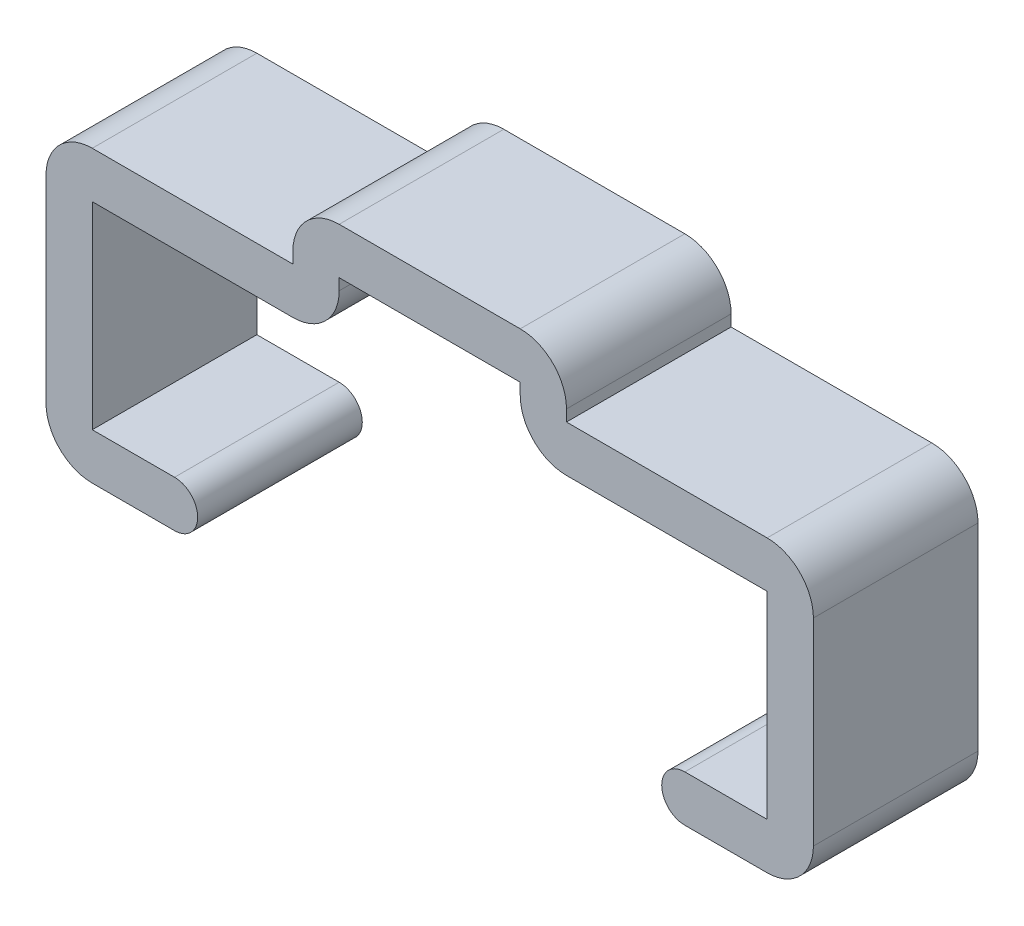
ISO-10303-21;
HEADER;
FILE_DESCRIPTION(('STEP AP214'),'2;1');
FILE_NAME('part.step','',(''),(''),'','','');
FILE_SCHEMA(('AUTOMOTIVE_DESIGN { 1 0 10303 214 1 1 1 1 }'));
ENDSEC;
DATA;
#1=APPLICATION_CONTEXT('core data for automotive mechanical design processes');
#2=APPLICATION_PROTOCOL_DEFINITION('international standard','automotive_design',2000,#1);
#3=PRODUCT_CONTEXT('',#1,'mechanical');
#4=PRODUCT('Part','Part','',(#3));
#5=PRODUCT_RELATED_PRODUCT_CATEGORY('part','',(#4));
#6=PRODUCT_DEFINITION_FORMATION('','',#4);
#7=PRODUCT_DEFINITION_CONTEXT('part definition',#1,'design');
#8=PRODUCT_DEFINITION('design','',#6,#7);
#9=PRODUCT_DEFINITION_SHAPE('','',#8);
#10=(LENGTH_UNIT() NAMED_UNIT(*) SI_UNIT(.MILLI.,.METRE.));
#11=(NAMED_UNIT(*) PLANE_ANGLE_UNIT() SI_UNIT($,.RADIAN.));
#12=(NAMED_UNIT(*) SI_UNIT($,.STERADIAN.) SOLID_ANGLE_UNIT());
#13=UNCERTAINTY_MEASURE_WITH_UNIT(LENGTH_MEASURE(1.E-05),#10,'distance_accuracy_value','');
#14=(GEOMETRIC_REPRESENTATION_CONTEXT(3) GLOBAL_UNCERTAINTY_ASSIGNED_CONTEXT((#13)) GLOBAL_UNIT_ASSIGNED_CONTEXT((#10,
#11,#12)) REPRESENTATION_CONTEXT('',''));
#15=CARTESIAN_POINT('',(0.,0.,0.));
#16=DIRECTION('',(0.,0.,1.));
#17=DIRECTION('',(1.,0.,0.));
#18=AXIS2_PLACEMENT_3D('',#15,#16,#17);
#19=CARTESIAN_POINT('',(-20.5,6.,10.));
#20=DIRECTION('',(-1.,0.,0.));
#21=DIRECTION('',(0.,-1.,0.));
#22=AXIS2_PLACEMENT_3D('',#19,#20,#21);
#23=PLANE('',#22);
#24=DIRECTION('',(0.,1.,0.));
#25=VECTOR('',#24,1.);
#26=CARTESIAN_POINT('',(-20.5,6.,0.));
#27=LINE('',#26,#25);
#28=CARTESIAN_POINT('',(-20.5,-6.,0.));
#29=VERTEX_POINT('',#28);
#30=CARTESIAN_POINT('',(-20.5,6.,0.));
#31=VERTEX_POINT('',#30);
#32=EDGE_CURVE('E260',#29,#31,#27,.T.);
#33=ORIENTED_EDGE('',*,*,#32,.T.);
#34=DIRECTION('',(0.,0.,-1.));
#35=VECTOR('',#34,1.);
#36=CARTESIAN_POINT('',(-20.5,6.,10.));
#37=LINE('',#36,#35);
#38=CARTESIAN_POINT('',(-20.5,6.,10.));
#39=VERTEX_POINT('',#38);
#40=EDGE_CURVE('E11',#39,#31,#37,.T.);
#41=ORIENTED_EDGE('',*,*,#40,.F.);
#42=DIRECTION('',(0.,1.,0.));
#43=VECTOR('',#42,1.);
#44=CARTESIAN_POINT('',(-20.5,6.,10.));
#45=LINE('',#44,#43);
#46=CARTESIAN_POINT('',(-20.5,-6.,10.));
#47=VERTEX_POINT('',#46);
#48=EDGE_CURVE('E342',#47,#39,#45,.T.);
#49=ORIENTED_EDGE('',*,*,#48,.F.);
#50=DIRECTION('',(0.,0.,-1.));
#51=VECTOR('',#50,1.);
#52=CARTESIAN_POINT('',(-20.5,-6.,10.));
#53=LINE('',#52,#51);
#54=EDGE_CURVE('E256',#47,#29,#53,.T.);
#55=ORIENTED_EDGE('',*,*,#54,.T.);
#56=EDGE_LOOP('',(#33,#41,#49,#55));
#57=FACE_BOUND('',#56,.T.);
#58=ADVANCED_FACE('F39',(#57),#23,.F.);
#59=CARTESIAN_POINT('',(-20.5,6.,10.));
#60=DIRECTION('',(0.,1.,0.));
#61=DIRECTION('',(0.,0.,1.));
#62=AXIS2_PLACEMENT_3D('',#59,#60,#61);
#63=PLANE('',#62);
#64=DIRECTION('',(1.,0.,0.));
#65=VECTOR('',#64,1.);
#66=CARTESIAN_POINT('',(-20.5,6.,0.));
#67=LINE('',#66,#65);
#68=CARTESIAN_POINT('',(-8.31,6.,0.));
#69=VERTEX_POINT('',#68);
#70=EDGE_CURVE('E264',#31,#69,#67,.T.);
#71=ORIENTED_EDGE('',*,*,#70,.T.);
#72=DIRECTION('',(0.,0.,-1.));
#73=VECTOR('',#72,1.);
#74=CARTESIAN_POINT('',(-8.31,6.,10.));
#75=LINE('',#74,#73);
#76=CARTESIAN_POINT('',(-8.31,6.,10.));
#77=VERTEX_POINT('',#76);
#78=EDGE_CURVE('E48',#77,#69,#75,.T.);
#79=ORIENTED_EDGE('',*,*,#78,.F.);
#80=DIRECTION('',(1.,0.,0.));
#81=VECTOR('',#80,1.);
#82=CARTESIAN_POINT('',(-20.5,6.,10.));
#83=LINE('',#82,#81);
#84=EDGE_CURVE('E159',#39,#77,#83,.T.);
#85=ORIENTED_EDGE('',*,*,#84,.F.);
#86=ORIENTED_EDGE('',*,*,#40,.T.);
#87=EDGE_LOOP('',(#71,#79,#85,#86));
#88=FACE_BOUND('',#87,.T.);
#89=ADVANCED_FACE('F548',(#88),#63,.F.);
#90=CARTESIAN_POINT('',(-8.31,8.81,10.));
#91=DIRECTION('',(0.,0.,-1.));
#92=DIRECTION('',(-1.,0.,0.));
#93=AXIS2_PLACEMENT_3D('',#90,#91,#92);
#94=CYLINDRICAL_SURFACE('',#93,2.81);
#95=CARTESIAN_POINT('',(-8.31,8.81,0.));
#96=DIRECTION('',(0.,0.,1.));
#97=DIRECTION('',(1.,0.,0.));
#98=AXIS2_PLACEMENT_3D('',#95,#96,#97);
#99=CIRCLE('',#98,2.81);
#100=CARTESIAN_POINT('',(-5.5,8.81,0.));
#101=VERTEX_POINT('',#100);
#102=EDGE_CURVE('E267',#69,#101,#99,.T.);
#103=ORIENTED_EDGE('',*,*,#102,.T.);
#104=DIRECTION('',(0.,0.,-1.));
#105=VECTOR('',#104,1.);
#106=CARTESIAN_POINT('',(-5.5,8.81,10.));
#107=LINE('',#106,#105);
#108=CARTESIAN_POINT('',(-5.5,8.81,10.));
#109=VERTEX_POINT('',#108);
#110=EDGE_CURVE('E433',#109,#101,#107,.T.);
#111=ORIENTED_EDGE('',*,*,#110,.F.);
#112=CARTESIAN_POINT('',(-8.31,8.81,10.));
#113=DIRECTION('',(0.,0.,1.));
#114=DIRECTION('',(1.,0.,0.));
#115=AXIS2_PLACEMENT_3D('',#112,#113,#114);
#116=CIRCLE('',#115,2.81);
#117=EDGE_CURVE('E443',#77,#109,#116,.T.);
#118=ORIENTED_EDGE('',*,*,#117,.F.);
#119=ORIENTED_EDGE('',*,*,#78,.T.);
#120=EDGE_LOOP('',(#103,#111,#118,#119));
#121=FACE_BOUND('',#120,.T.);
#122=ADVANCED_FACE('F441',(#121),#94,.T.);
#123=CARTESIAN_POINT('',(-5.5,9.5,10.));
#124=DIRECTION('',(-1.,0.,0.));
#125=DIRECTION('',(0.,-1.,0.));
#126=AXIS2_PLACEMENT_3D('',#123,#124,#125);
#127=PLANE('',#126);
#128=DIRECTION('',(0.,1.,0.));
#129=VECTOR('',#128,1.);
#130=CARTESIAN_POINT('',(-5.5,9.5,0.));
#131=LINE('',#130,#129);
#132=CARTESIAN_POINT('',(-5.5,9.5,0.));
#133=VERTEX_POINT('',#132);
#134=EDGE_CURVE('E270',#101,#133,#131,.T.);
#135=ORIENTED_EDGE('',*,*,#134,.T.);
#136=DIRECTION('',(0.,0.,-1.));
#137=VECTOR('',#136,1.);
#138=CARTESIAN_POINT('',(-5.5,9.5,10.));
#139=LINE('',#138,#137);
#140=CARTESIAN_POINT('',(-5.5,9.5,10.));
#141=VERTEX_POINT('',#140);
#142=EDGE_CURVE('E429',#141,#133,#139,.T.);
#143=ORIENTED_EDGE('',*,*,#142,.F.);
#144=DIRECTION('',(0.,1.,0.));
#145=VECTOR('',#144,1.);
#146=CARTESIAN_POINT('',(-5.5,9.5,10.));
#147=LINE('',#146,#145);
#148=EDGE_CURVE('E462',#109,#141,#147,.T.);
#149=ORIENTED_EDGE('',*,*,#148,.F.);
#150=ORIENTED_EDGE('',*,*,#110,.T.);
#151=EDGE_LOOP('',(#135,#143,#149,#150));
#152=FACE_BOUND('',#151,.T.);
#153=ADVANCED_FACE('F452',(#152),#127,.F.);
#154=CARTESIAN_POINT('',(-5.5,9.5,10.));
#155=DIRECTION('',(0.,1.,0.));
#156=DIRECTION('',(0.,0.,1.));
#157=AXIS2_PLACEMENT_3D('',#154,#155,#156);
#158=PLANE('',#157);
#159=DIRECTION('',(1.,0.,0.));
#160=VECTOR('',#159,1.);
#161=CARTESIAN_POINT('',(-5.5,9.5,0.));
#162=LINE('',#161,#160);
#163=CARTESIAN_POINT('',(5.5,9.5,0.));
#164=VERTEX_POINT('',#163);
#165=EDGE_CURVE('E273',#133,#164,#162,.T.);
#166=ORIENTED_EDGE('',*,*,#165,.T.);
#167=DIRECTION('',(0.,0.,-1.));
#168=VECTOR('',#167,1.);
#169=CARTESIAN_POINT('',(5.5,9.5,10.));
#170=LINE('',#169,#168);
#171=CARTESIAN_POINT('',(5.5,9.5,10.));
#172=VERTEX_POINT('',#171);
#173=EDGE_CURVE('E425',#172,#164,#170,.T.);
#174=ORIENTED_EDGE('',*,*,#173,.F.);
#175=DIRECTION('',(1.,0.,0.));
#176=VECTOR('',#175,1.);
#177=CARTESIAN_POINT('',(-5.5,9.5,10.));
#178=LINE('',#177,#176);
#179=EDGE_CURVE('E458',#141,#172,#178,.T.);
#180=ORIENTED_EDGE('',*,*,#179,.F.);
#181=ORIENTED_EDGE('',*,*,#142,.T.);
#182=EDGE_LOOP('',(#166,#174,#180,#181));
#183=FACE_BOUND('',#182,.T.);
#184=ADVANCED_FACE('F456',(#183),#158,.F.);
#185=CARTESIAN_POINT('',(5.5,9.5,10.));
#186=DIRECTION('',(1.,0.,0.));
#187=DIRECTION('',(0.,1.,0.));
#188=AXIS2_PLACEMENT_3D('',#185,#186,#187);
#189=PLANE('',#188);
#190=DIRECTION('',(0.,-1.,0.));
#191=VECTOR('',#190,1.);
#192=CARTESIAN_POINT('',(5.5,9.5,0.));
#193=LINE('',#192,#191);
#194=CARTESIAN_POINT('',(5.5,8.81,0.));
#195=VERTEX_POINT('',#194);
#196=EDGE_CURVE('E276',#164,#195,#193,.T.);
#197=ORIENTED_EDGE('',*,*,#196,.T.);
#198=DIRECTION('',(0.,0.,-1.));
#199=VECTOR('',#198,1.);
#200=CARTESIAN_POINT('',(5.5,8.81,10.));
#201=LINE('',#200,#199);
#202=CARTESIAN_POINT('',(5.5,8.81,10.));
#203=VERTEX_POINT('',#202);
#204=EDGE_CURVE('E421',#203,#195,#201,.T.);
#205=ORIENTED_EDGE('',*,*,#204,.F.);
#206=DIRECTION('',(0.,-1.,0.));
#207=VECTOR('',#206,1.);
#208=CARTESIAN_POINT('',(5.5,9.5,10.));
#209=LINE('',#208,#207);
#210=EDGE_CURVE('E461',#172,#203,#209,.T.);
#211=ORIENTED_EDGE('',*,*,#210,.F.);
#212=ORIENTED_EDGE('',*,*,#173,.T.);
#213=EDGE_LOOP('',(#197,#205,#211,#212));
#214=FACE_BOUND('',#213,.T.);
#215=ADVANCED_FACE('F561',(#214),#189,.F.);
#216=CARTESIAN_POINT('',(8.31,8.81,10.));
#217=DIRECTION('',(0.,0.,-1.));
#218=DIRECTION('',(-1.,0.,0.));
#219=AXIS2_PLACEMENT_3D('',#216,#217,#218);
#220=CYLINDRICAL_SURFACE('',#219,2.81);
#221=CARTESIAN_POINT('',(8.31,8.81,0.));
#222=DIRECTION('',(0.,0.,1.));
#223=DIRECTION('',(1.,0.,0.));
#224=AXIS2_PLACEMENT_3D('',#221,#222,#223);
#225=CIRCLE('',#224,2.81);
#226=CARTESIAN_POINT('',(8.31,6.,0.));
#227=VERTEX_POINT('',#226);
#228=EDGE_CURVE('E279',#195,#227,#225,.T.);
#229=ORIENTED_EDGE('',*,*,#228,.T.);
#230=DIRECTION('',(0.,0.,-1.));
#231=VECTOR('',#230,1.);
#232=CARTESIAN_POINT('',(8.31,6.,10.));
#233=LINE('',#232,#231);
#234=CARTESIAN_POINT('',(8.31,6.,10.));
#235=VERTEX_POINT('',#234);
#236=EDGE_CURVE('E417',#235,#227,#233,.T.);
#237=ORIENTED_EDGE('',*,*,#236,.F.);
#238=CARTESIAN_POINT('',(8.31,8.81,10.));
#239=DIRECTION('',(0.,0.,1.));
#240=DIRECTION('',(1.,0.,0.));
#241=AXIS2_PLACEMENT_3D('',#238,#239,#240);
#242=CIRCLE('',#241,2.81);
#243=EDGE_CURVE('E466',#203,#235,#242,.T.);
#244=ORIENTED_EDGE('',*,*,#243,.F.);
#245=ORIENTED_EDGE('',*,*,#204,.T.);
#246=EDGE_LOOP('',(#229,#237,#244,#245));
#247=FACE_BOUND('',#246,.T.);
#248=ADVANCED_FACE('F564',(#247),#220,.T.);
#249=CARTESIAN_POINT('',(8.31,6.,10.));
#250=DIRECTION('',(0.,1.,0.));
#251=DIRECTION('',(0.,0.,1.));
#252=AXIS2_PLACEMENT_3D('',#249,#250,#251);
#253=PLANE('',#252);
#254=DIRECTION('',(1.,0.,0.));
#255=VECTOR('',#254,1.);
#256=CARTESIAN_POINT('',(8.31,6.,0.));
#257=LINE('',#256,#255);
#258=CARTESIAN_POINT('',(20.5,6.,0.));
#259=VERTEX_POINT('',#258);
#260=EDGE_CURVE('E282',#227,#259,#257,.T.);
#261=ORIENTED_EDGE('',*,*,#260,.T.);
#262=DIRECTION('',(0.,0.,-1.));
#263=VECTOR('',#262,1.);
#264=CARTESIAN_POINT('',(20.5,6.,10.));
#265=LINE('',#264,#263);
#266=CARTESIAN_POINT('',(20.5,6.,10.));
#267=VERTEX_POINT('',#266);
#268=EDGE_CURVE('E413',#267,#259,#265,.T.);
#269=ORIENTED_EDGE('',*,*,#268,.F.);
#270=DIRECTION('',(1.,0.,0.));
#271=VECTOR('',#270,1.);
#272=CARTESIAN_POINT('',(8.31,6.,10.));
#273=LINE('',#272,#271);
#274=EDGE_CURVE('E473',#235,#267,#273,.T.);
#275=ORIENTED_EDGE('',*,*,#274,.F.);
#276=ORIENTED_EDGE('',*,*,#236,.T.);
#277=EDGE_LOOP('',(#261,#269,#275,#276));
#278=FACE_BOUND('',#277,.T.);
#279=ADVANCED_FACE('F568',(#278),#253,.F.);
#280=CARTESIAN_POINT('',(20.5,6.,10.));
#281=DIRECTION('',(1.,0.,0.));
#282=DIRECTION('',(0.,1.,0.));
#283=AXIS2_PLACEMENT_3D('',#280,#281,#282);
#284=PLANE('',#283);
#285=DIRECTION('',(0.,-1.,0.));
#286=VECTOR('',#285,1.);
#287=CARTESIAN_POINT('',(20.5,6.,0.));
#288=LINE('',#287,#286);
#289=CARTESIAN_POINT('',(20.5,-6.,0.));
#290=VERTEX_POINT('',#289);
#291=EDGE_CURVE('E285',#259,#290,#288,.T.);
#292=ORIENTED_EDGE('',*,*,#291,.T.);
#293=DIRECTION('',(0.,0.,-1.));
#294=VECTOR('',#293,1.);
#295=CARTESIAN_POINT('',(20.5,-6.,10.));
#296=LINE('',#295,#294);
#297=CARTESIAN_POINT('',(20.5,-6.,10.));
#298=VERTEX_POINT('',#297);
#299=EDGE_CURVE('E409',#298,#290,#296,.T.);
#300=ORIENTED_EDGE('',*,*,#299,.F.);
#301=DIRECTION('',(0.,-1.,0.));
#302=VECTOR('',#301,1.);
#303=CARTESIAN_POINT('',(20.5,6.,10.));
#304=LINE('',#303,#302);
#305=EDGE_CURVE('E476',#267,#298,#304,.T.);
#306=ORIENTED_EDGE('',*,*,#305,.F.);
#307=ORIENTED_EDGE('',*,*,#268,.T.);
#308=EDGE_LOOP('',(#292,#300,#306,#307));
#309=FACE_BOUND('',#308,.T.);
#310=ADVANCED_FACE('F572',(#309),#284,.F.);
#311=CARTESIAN_POINT('',(15.5,-6.,10.));
#312=DIRECTION('',(0.,-1.,0.));
#313=DIRECTION('',(0.,0.,-1.));
#314=AXIS2_PLACEMENT_3D('',#311,#312,#313);
#315=PLANE('',#314);
#316=DIRECTION('',(-1.,0.,0.));
#317=VECTOR('',#316,1.);
#318=CARTESIAN_POINT('',(15.5,-6.,0.));
#319=LINE('',#318,#317);
#320=CARTESIAN_POINT('',(15.5,-6.,0.));
#321=VERTEX_POINT('',#320);
#322=EDGE_CURVE('E288',#290,#321,#319,.T.);
#323=ORIENTED_EDGE('',*,*,#322,.T.);
#324=DIRECTION('',(0.,0.,-1.));
#325=VECTOR('',#324,1.);
#326=CARTESIAN_POINT('',(15.5,-6.,10.));
#327=LINE('',#326,#325);
#328=CARTESIAN_POINT('',(15.5,-6.,10.));
#329=VERTEX_POINT('',#328);
#330=EDGE_CURVE('E405',#329,#321,#327,.T.);
#331=ORIENTED_EDGE('',*,*,#330,.F.);
#332=DIRECTION('',(-1.,0.,0.));
#333=VECTOR('',#332,1.);
#334=CARTESIAN_POINT('',(15.5,-6.,10.));
#335=LINE('',#334,#333);
#336=EDGE_CURVE('E479',#298,#329,#335,.T.);
#337=ORIENTED_EDGE('',*,*,#336,.F.);
#338=ORIENTED_EDGE('',*,*,#299,.T.);
#339=EDGE_LOOP('',(#323,#331,#337,#338));
#340=FACE_BOUND('',#339,.T.);
#341=ADVANCED_FACE('F576',(#340),#315,.F.);
#342=CARTESIAN_POINT('',(15.5,-7.405,10.));
#343=DIRECTION('',(0.,0.,-1.));
#344=DIRECTION('',(-1.,0.,0.));
#345=AXIS2_PLACEMENT_3D('',#342,#343,#344);
#346=CYLINDRICAL_SURFACE('',#345,1.405);
#347=CARTESIAN_POINT('',(15.5,-7.405,0.));
#348=DIRECTION('',(0.,0.,1.));
#349=DIRECTION('',(1.,0.,0.));
#350=AXIS2_PLACEMENT_3D('',#347,#348,#349);
#351=CIRCLE('',#350,1.405);
#352=CARTESIAN_POINT('',(15.5,-8.81,0.));
#353=VERTEX_POINT('',#352);
#354=EDGE_CURVE('E291',#321,#353,#351,.T.);
#355=ORIENTED_EDGE('',*,*,#354,.T.);
#356=DIRECTION('',(0.,0.,-1.));
#357=VECTOR('',#356,1.);
#358=CARTESIAN_POINT('',(15.5,-8.81,10.));
#359=LINE('',#358,#357);
#360=CARTESIAN_POINT('',(15.5,-8.81,10.));
#361=VERTEX_POINT('',#360);
#362=EDGE_CURVE('E401',#361,#353,#359,.T.);
#363=ORIENTED_EDGE('',*,*,#362,.F.);
#364=CARTESIAN_POINT('',(15.5,-7.405,10.));
#365=DIRECTION('',(0.,0.,1.));
#366=DIRECTION('',(1.,0.,0.));
#367=AXIS2_PLACEMENT_3D('',#364,#365,#366);
#368=CIRCLE('',#367,1.405);
#369=EDGE_CURVE('E482',#329,#361,#368,.T.);
#370=ORIENTED_EDGE('',*,*,#369,.F.);
#371=ORIENTED_EDGE('',*,*,#330,.T.);
#372=EDGE_LOOP('',(#355,#363,#370,#371));
#373=FACE_BOUND('',#372,.T.);
#374=ADVANCED_FACE('F580',(#373),#346,.T.);
#375=CARTESIAN_POINT('',(20.5,-8.81,10.));
#376=DIRECTION('',(0.,1.,0.));
#377=DIRECTION('',(0.,0.,1.));
#378=AXIS2_PLACEMENT_3D('',#375,#376,#377);
#379=PLANE('',#378);
#380=DIRECTION('',(1.,0.,0.));
#381=VECTOR('',#380,1.);
#382=CARTESIAN_POINT('',(20.5,-8.81,0.));
#383=LINE('',#382,#381);
#384=CARTESIAN_POINT('',(20.5,-8.81,0.));
#385=VERTEX_POINT('',#384);
#386=EDGE_CURVE('E294',#353,#385,#383,.T.);
#387=ORIENTED_EDGE('',*,*,#386,.T.);
#388=DIRECTION('',(0.,0.,-1.));
#389=VECTOR('',#388,1.);
#390=CARTESIAN_POINT('',(20.5,-8.81,10.));
#391=LINE('',#390,#389);
#392=CARTESIAN_POINT('',(20.5,-8.81,10.));
#393=VERTEX_POINT('',#392);
#394=EDGE_CURVE('E397',#393,#385,#391,.T.);
#395=ORIENTED_EDGE('',*,*,#394,.F.);
#396=DIRECTION('',(1.,0.,0.));
#397=VECTOR('',#396,1.);
#398=CARTESIAN_POINT('',(20.5,-8.81,10.));
#399=LINE('',#398,#397);
#400=EDGE_CURVE('E485',#361,#393,#399,.T.);
#401=ORIENTED_EDGE('',*,*,#400,.F.);
#402=ORIENTED_EDGE('',*,*,#362,.T.);
#403=EDGE_LOOP('',(#387,#395,#401,#402));
#404=FACE_BOUND('',#403,.T.);
#405=ADVANCED_FACE('F584',(#404),#379,.F.);
#406=CARTESIAN_POINT('',(20.5,-6.,10.));
#407=DIRECTION('',(0.,0.,-1.));
#408=DIRECTION('',(-1.,0.,0.));
#409=AXIS2_PLACEMENT_3D('',#406,#407,#408);
#410=CYLINDRICAL_SURFACE('',#409,2.81);
#411=CARTESIAN_POINT('',(20.5,-6.,0.));
#412=DIRECTION('',(0.,0.,1.));
#413=DIRECTION('',(1.,0.,0.));
#414=AXIS2_PLACEMENT_3D('',#411,#412,#413);
#415=CIRCLE('',#414,2.81);
#416=CARTESIAN_POINT('',(23.31,-6.,0.));
#417=VERTEX_POINT('',#416);
#418=EDGE_CURVE('E297',#385,#417,#415,.T.);
#419=ORIENTED_EDGE('',*,*,#418,.T.);
#420=DIRECTION('',(0.,0.,-1.));
#421=VECTOR('',#420,1.);
#422=CARTESIAN_POINT('',(23.31,-6.,10.));
#423=LINE('',#422,#421);
#424=CARTESIAN_POINT('',(23.31,-6.,10.));
#425=VERTEX_POINT('',#424);
#426=EDGE_CURVE('E393',#425,#417,#423,.T.);
#427=ORIENTED_EDGE('',*,*,#426,.F.);
#428=CARTESIAN_POINT('',(20.5,-6.,10.));
#429=DIRECTION('',(0.,0.,1.));
#430=DIRECTION('',(1.,0.,0.));
#431=AXIS2_PLACEMENT_3D('',#428,#429,#430);
#432=CIRCLE('',#431,2.81);
#433=EDGE_CURVE('E488',#393,#425,#432,.T.);
#434=ORIENTED_EDGE('',*,*,#433,.F.);
#435=ORIENTED_EDGE('',*,*,#394,.T.);
#436=EDGE_LOOP('',(#419,#427,#434,#435));
#437=FACE_BOUND('',#436,.T.);
#438=ADVANCED_FACE('F588',(#437),#410,.T.);
#439=CARTESIAN_POINT('',(23.31,-6.,10.));
#440=DIRECTION('',(-1.,0.,0.));
#441=DIRECTION('',(0.,-1.,0.));
#442=AXIS2_PLACEMENT_3D('',#439,#440,#441);
#443=PLANE('',#442);
#444=DIRECTION('',(0.,1.,0.));
#445=VECTOR('',#444,1.);
#446=CARTESIAN_POINT('',(23.31,-6.,0.));
#447=LINE('',#446,#445);
#448=CARTESIAN_POINT('',(23.31,6.,0.));
#449=VERTEX_POINT('',#448);
#450=EDGE_CURVE('E300',#417,#449,#447,.T.);
#451=ORIENTED_EDGE('',*,*,#450,.T.);
#452=DIRECTION('',(0.,0.,-1.));
#453=VECTOR('',#452,1.);
#454=CARTESIAN_POINT('',(23.31,6.,10.));
#455=LINE('',#454,#453);
#456=CARTESIAN_POINT('',(23.31,6.,10.));
#457=VERTEX_POINT('',#456);
#458=EDGE_CURVE('E389',#457,#449,#455,.T.);
#459=ORIENTED_EDGE('',*,*,#458,.F.);
#460=DIRECTION('',(0.,1.,0.));
#461=VECTOR('',#460,1.);
#462=CARTESIAN_POINT('',(23.31,-6.,10.));
#463=LINE('',#462,#461);
#464=EDGE_CURVE('E491',#425,#457,#463,.T.);
#465=ORIENTED_EDGE('',*,*,#464,.F.);
#466=ORIENTED_EDGE('',*,*,#426,.T.);
#467=EDGE_LOOP('',(#451,#459,#465,#466));
#468=FACE_BOUND('',#467,.T.);
#469=ADVANCED_FACE('F592',(#468),#443,.F.);
#470=CARTESIAN_POINT('',(20.5,6.,10.));
#471=DIRECTION('',(0.,0.,-1.));
#472=DIRECTION('',(-1.,0.,0.));
#473=AXIS2_PLACEMENT_3D('',#470,#471,#472);
#474=CYLINDRICAL_SURFACE('',#473,2.81);
#475=CARTESIAN_POINT('',(20.5,6.,0.));
#476=DIRECTION('',(0.,0.,1.));
#477=DIRECTION('',(1.,0.,0.));
#478=AXIS2_PLACEMENT_3D('',#475,#476,#477);
#479=CIRCLE('',#478,2.81);
#480=CARTESIAN_POINT('',(20.5,8.81,0.));
#481=VERTEX_POINT('',#480);
#482=EDGE_CURVE('E303',#449,#481,#479,.T.);
#483=ORIENTED_EDGE('',*,*,#482,.T.);
#484=DIRECTION('',(0.,0.,-1.));
#485=VECTOR('',#484,1.);
#486=CARTESIAN_POINT('',(20.5,8.81,10.));
#487=LINE('',#486,#485);
#488=CARTESIAN_POINT('',(20.5,8.81,10.));
#489=VERTEX_POINT('',#488);
#490=EDGE_CURVE('E385',#489,#481,#487,.T.);
#491=ORIENTED_EDGE('',*,*,#490,.F.);
#492=CARTESIAN_POINT('',(20.5,6.,10.));
#493=DIRECTION('',(0.,0.,1.));
#494=DIRECTION('',(1.,0.,0.));
#495=AXIS2_PLACEMENT_3D('',#492,#493,#494);
#496=CIRCLE('',#495,2.81);
#497=EDGE_CURVE('E494',#457,#489,#496,.T.);
#498=ORIENTED_EDGE('',*,*,#497,.F.);
#499=ORIENTED_EDGE('',*,*,#458,.T.);
#500=EDGE_LOOP('',(#483,#491,#498,#499));
#501=FACE_BOUND('',#500,.T.);
#502=ADVANCED_FACE('F596',(#501),#474,.T.);
#503=CARTESIAN_POINT('',(20.5,8.81,10.));
#504=DIRECTION('',(0.,-1.,0.));
#505=DIRECTION('',(0.,0.,-1.));
#506=AXIS2_PLACEMENT_3D('',#503,#504,#505);
#507=PLANE('',#506);
#508=DIRECTION('',(-1.,0.,0.));
#509=VECTOR('',#508,1.);
#510=CARTESIAN_POINT('',(20.5,8.81,0.));
#511=LINE('',#510,#509);
#512=CARTESIAN_POINT('',(8.31,8.81,0.));
#513=VERTEX_POINT('',#512);
#514=EDGE_CURVE('E306',#481,#513,#511,.T.);
#515=ORIENTED_EDGE('',*,*,#514,.T.);
#516=DIRECTION('',(0.,0.,-1.));
#517=VECTOR('',#516,1.);
#518=CARTESIAN_POINT('',(8.31,8.81,10.));
#519=LINE('',#518,#517);
#520=CARTESIAN_POINT('',(8.31,8.81,10.));
#521=VERTEX_POINT('',#520);
#522=EDGE_CURVE('E381',#521,#513,#519,.T.);
#523=ORIENTED_EDGE('',*,*,#522,.F.);
#524=DIRECTION('',(-1.,0.,0.));
#525=VECTOR('',#524,1.);
#526=CARTESIAN_POINT('',(20.5,8.81,10.));
#527=LINE('',#526,#525);
#528=EDGE_CURVE('E497',#489,#521,#527,.T.);
#529=ORIENTED_EDGE('',*,*,#528,.F.);
#530=ORIENTED_EDGE('',*,*,#490,.T.);
#531=EDGE_LOOP('',(#515,#523,#529,#530));
#532=FACE_BOUND('',#531,.T.);
#533=ADVANCED_FACE('F600',(#532),#507,.F.);
#534=CARTESIAN_POINT('',(8.31,8.81,10.));
#535=DIRECTION('',(-1.,0.,0.));
#536=DIRECTION('',(0.,0.,1.));
#537=AXIS2_PLACEMENT_3D('',#534,#535,#536);
#538=PLANE('',#537);
#539=DIRECTION('',(0.,1.,0.));
#540=VECTOR('',#539,1.);
#541=CARTESIAN_POINT('',(8.31,8.81,0.));
#542=LINE('',#541,#540);
#543=CARTESIAN_POINT('',(8.31,9.5,0.));
#544=VERTEX_POINT('',#543);
#545=EDGE_CURVE('E309',#513,#544,#542,.T.);
#546=ORIENTED_EDGE('',*,*,#545,.T.);
#547=DIRECTION('',(0.,0.,-1.));
#548=VECTOR('',#547,1.);
#549=CARTESIAN_POINT('',(8.31,9.5,10.));
#550=LINE('',#549,#548);
#551=CARTESIAN_POINT('',(8.31,9.5,10.));
#552=VERTEX_POINT('',#551);
#553=EDGE_CURVE('E377',#552,#544,#550,.T.);
#554=ORIENTED_EDGE('',*,*,#553,.F.);
#555=DIRECTION('',(0.,1.,0.));
#556=VECTOR('',#555,1.);
#557=CARTESIAN_POINT('',(8.31,8.81,10.));
#558=LINE('',#557,#556);
#559=EDGE_CURVE('E500',#521,#552,#558,.T.);
#560=ORIENTED_EDGE('',*,*,#559,.F.);
#561=ORIENTED_EDGE('',*,*,#522,.T.);
#562=EDGE_LOOP('',(#546,#554,#560,#561));
#563=FACE_BOUND('',#562,.T.);
#564=ADVANCED_FACE('F604',(#563),#538,.F.);
#565=CARTESIAN_POINT('',(5.5,9.5,10.));
#566=DIRECTION('',(0.,0.,-1.));
#567=DIRECTION('',(-1.,0.,0.));
#568=AXIS2_PLACEMENT_3D('',#565,#566,#567);
#569=CYLINDRICAL_SURFACE('',#568,2.81);
#570=CARTESIAN_POINT('',(5.5,9.5,0.));
#571=DIRECTION('',(0.,0.,1.));
#572=DIRECTION('',(1.,0.,0.));
#573=AXIS2_PLACEMENT_3D('',#570,#571,#572);
#574=CIRCLE('',#573,2.81);
#575=CARTESIAN_POINT('',(5.5,12.31,0.));
#576=VERTEX_POINT('',#575);
#577=EDGE_CURVE('E312',#544,#576,#574,.T.);
#578=ORIENTED_EDGE('',*,*,#577,.T.);
#579=DIRECTION('',(0.,0.,-1.));
#580=VECTOR('',#579,1.);
#581=CARTESIAN_POINT('',(5.5,12.31,10.));
#582=LINE('',#581,#580);
#583=CARTESIAN_POINT('',(5.5,12.31,10.));
#584=VERTEX_POINT('',#583);
#585=EDGE_CURVE('E373',#584,#576,#582,.T.);
#586=ORIENTED_EDGE('',*,*,#585,.F.);
#587=CARTESIAN_POINT('',(5.5,9.5,10.));
#588=DIRECTION('',(0.,0.,1.));
#589=DIRECTION('',(1.,0.,0.));
#590=AXIS2_PLACEMENT_3D('',#587,#588,#589);
#591=CIRCLE('',#590,2.81);
#592=EDGE_CURVE('E503',#552,#584,#591,.T.);
#593=ORIENTED_EDGE('',*,*,#592,.F.);
#594=ORIENTED_EDGE('',*,*,#553,.T.);
#595=EDGE_LOOP('',(#578,#586,#593,#594));
#596=FACE_BOUND('',#595,.T.);
#597=ADVANCED_FACE('F608',(#596),#569,.T.);
#598=CARTESIAN_POINT('',(-5.5,12.31,10.));
#599=DIRECTION('',(0.,-1.,0.));
#600=DIRECTION('',(1.,0.,0.));
#601=AXIS2_PLACEMENT_3D('',#598,#599,#600);
#602=PLANE('',#601);
#603=DIRECTION('',(-1.,0.,0.));
#604=VECTOR('',#603,1.);
#605=CARTESIAN_POINT('',(-5.5,12.31,0.));
#606=LINE('',#605,#604);
#607=CARTESIAN_POINT('',(-5.5,12.31,0.));
#608=VERTEX_POINT('',#607);
#609=EDGE_CURVE('E315',#576,#608,#606,.T.);
#610=ORIENTED_EDGE('',*,*,#609,.T.);
#611=DIRECTION('',(0.,0.,-1.));
#612=VECTOR('',#611,1.);
#613=CARTESIAN_POINT('',(-5.5,12.31,10.));
#614=LINE('',#613,#612);
#615=CARTESIAN_POINT('',(-5.5,12.31,10.));
#616=VERTEX_POINT('',#615);
#617=EDGE_CURVE('E369',#616,#608,#614,.T.);
#618=ORIENTED_EDGE('',*,*,#617,.F.);
#619=DIRECTION('',(-1.,0.,0.));
#620=VECTOR('',#619,1.);
#621=CARTESIAN_POINT('',(-5.5,12.31,10.));
#622=LINE('',#621,#620);
#623=EDGE_CURVE('E506',#584,#616,#622,.T.);
#624=ORIENTED_EDGE('',*,*,#623,.F.);
#625=ORIENTED_EDGE('',*,*,#585,.T.);
#626=EDGE_LOOP('',(#610,#618,#624,#625));
#627=FACE_BOUND('',#626,.T.);
#628=ADVANCED_FACE('F612',(#627),#602,.F.);
#629=CARTESIAN_POINT('',(-5.5,9.5,10.));
#630=DIRECTION('',(0.,0.,-1.));
#631=DIRECTION('',(-1.,0.,0.));
#632=AXIS2_PLACEMENT_3D('',#629,#630,#631);
#633=CYLINDRICAL_SURFACE('',#632,2.81);
#634=CARTESIAN_POINT('',(-5.5,9.5,0.));
#635=DIRECTION('',(0.,0.,1.));
#636=DIRECTION('',(1.,0.,0.));
#637=AXIS2_PLACEMENT_3D('',#634,#635,#636);
#638=CIRCLE('',#637,2.81);
#639=CARTESIAN_POINT('',(-8.31,9.5,0.));
#640=VERTEX_POINT('',#639);
#641=EDGE_CURVE('E318',#608,#640,#638,.T.);
#642=ORIENTED_EDGE('',*,*,#641,.T.);
#643=DIRECTION('',(0.,0.,-1.));
#644=VECTOR('',#643,1.);
#645=CARTESIAN_POINT('',(-8.31,9.5,10.));
#646=LINE('',#645,#644);
#647=CARTESIAN_POINT('',(-8.31,9.5,10.));
#648=VERTEX_POINT('',#647);
#649=EDGE_CURVE('E365',#648,#640,#646,.T.);
#650=ORIENTED_EDGE('',*,*,#649,.F.);
#651=CARTESIAN_POINT('',(-5.5,9.5,10.));
#652=DIRECTION('',(0.,0.,1.));
#653=DIRECTION('',(1.,0.,0.));
#654=AXIS2_PLACEMENT_3D('',#651,#652,#653);
#655=CIRCLE('',#654,2.81);
#656=EDGE_CURVE('E509',#616,#648,#655,.T.);
#657=ORIENTED_EDGE('',*,*,#656,.F.);
#658=ORIENTED_EDGE('',*,*,#617,.T.);
#659=EDGE_LOOP('',(#642,#650,#657,#658));
#660=FACE_BOUND('',#659,.T.);
#661=ADVANCED_FACE('F616',(#660),#633,.T.);
#662=CARTESIAN_POINT('',(-8.31,8.81,10.));
#663=DIRECTION('',(1.,0.,0.));
#664=DIRECTION('',(0.,0.,-1.));
#665=AXIS2_PLACEMENT_3D('',#662,#663,#664);
#666=PLANE('',#665);
#667=DIRECTION('',(0.,-1.,0.));
#668=VECTOR('',#667,1.);
#669=CARTESIAN_POINT('',(-8.31,8.81,0.));
#670=LINE('',#669,#668);
#671=CARTESIAN_POINT('',(-8.31,8.81,0.));
#672=VERTEX_POINT('',#671);
#673=EDGE_CURVE('E321',#640,#672,#670,.T.);
#674=ORIENTED_EDGE('',*,*,#673,.T.);
#675=DIRECTION('',(0.,0.,-1.));
#676=VECTOR('',#675,1.);
#677=CARTESIAN_POINT('',(-8.31,8.81,10.));
#678=LINE('',#677,#676);
#679=CARTESIAN_POINT('',(-8.31,8.81,10.));
#680=VERTEX_POINT('',#679);
#681=EDGE_CURVE('E361',#680,#672,#678,.T.);
#682=ORIENTED_EDGE('',*,*,#681,.F.);
#683=DIRECTION('',(0.,-1.,0.));
#684=VECTOR('',#683,1.);
#685=CARTESIAN_POINT('',(-8.31,8.81,10.));
#686=LINE('',#685,#684);
#687=EDGE_CURVE('E512',#648,#680,#686,.T.);
#688=ORIENTED_EDGE('',*,*,#687,.F.);
#689=ORIENTED_EDGE('',*,*,#649,.T.);
#690=EDGE_LOOP('',(#674,#682,#688,#689));
#691=FACE_BOUND('',#690,.T.);
#692=ADVANCED_FACE('F620',(#691),#666,.F.);
#693=CARTESIAN_POINT('',(-20.5,8.81,10.));
#694=DIRECTION('',(0.,-1.,0.));
#695=DIRECTION('',(0.,0.,-1.));
#696=AXIS2_PLACEMENT_3D('',#693,#694,#695);
#697=PLANE('',#696);
#698=DIRECTION('',(-1.,0.,0.));
#699=VECTOR('',#698,1.);
#700=CARTESIAN_POINT('',(-20.5,8.81,0.));
#701=LINE('',#700,#699);
#702=CARTESIAN_POINT('',(-20.5,8.81,0.));
#703=VERTEX_POINT('',#702);
#704=EDGE_CURVE('E324',#672,#703,#701,.T.);
#705=ORIENTED_EDGE('',*,*,#704,.T.);
#706=DIRECTION('',(0.,0.,-1.));
#707=VECTOR('',#706,1.);
#708=CARTESIAN_POINT('',(-20.5,8.81,10.));
#709=LINE('',#708,#707);
#710=CARTESIAN_POINT('',(-20.5,8.81,10.));
#711=VERTEX_POINT('',#710);
#712=EDGE_CURVE('E357',#711,#703,#709,.T.);
#713=ORIENTED_EDGE('',*,*,#712,.F.);
#714=DIRECTION('',(-1.,0.,0.));
#715=VECTOR('',#714,1.);
#716=CARTESIAN_POINT('',(-20.5,8.81,10.));
#717=LINE('',#716,#715);
#718=EDGE_CURVE('E515',#680,#711,#717,.T.);
#719=ORIENTED_EDGE('',*,*,#718,.F.);
#720=ORIENTED_EDGE('',*,*,#681,.T.);
#721=EDGE_LOOP('',(#705,#713,#719,#720));
#722=FACE_BOUND('',#721,.T.);
#723=ADVANCED_FACE('F624',(#722),#697,.F.);
#724=CARTESIAN_POINT('',(-20.5,6.,10.));
#725=DIRECTION('',(0.,0.,-1.));
#726=DIRECTION('',(-1.,0.,0.));
#727=AXIS2_PLACEMENT_3D('',#724,#725,#726);
#728=CYLINDRICAL_SURFACE('',#727,2.81);
#729=CARTESIAN_POINT('',(-20.5,6.,0.));
#730=DIRECTION('',(0.,0.,1.));
#731=DIRECTION('',(1.,0.,0.));
#732=AXIS2_PLACEMENT_3D('',#729,#730,#731);
#733=CIRCLE('',#732,2.81);
#734=CARTESIAN_POINT('',(-23.31,6.,0.));
#735=VERTEX_POINT('',#734);
#736=EDGE_CURVE('E327',#703,#735,#733,.T.);
#737=ORIENTED_EDGE('',*,*,#736,.T.);
#738=DIRECTION('',(0.,0.,-1.));
#739=VECTOR('',#738,1.);
#740=CARTESIAN_POINT('',(-23.31,6.,10.));
#741=LINE('',#740,#739);
#742=CARTESIAN_POINT('',(-23.31,6.,10.));
#743=VERTEX_POINT('',#742);
#744=EDGE_CURVE('E353',#743,#735,#741,.T.);
#745=ORIENTED_EDGE('',*,*,#744,.F.);
#746=CARTESIAN_POINT('',(-20.5,6.,10.));
#747=DIRECTION('',(0.,0.,1.));
#748=DIRECTION('',(1.,0.,0.));
#749=AXIS2_PLACEMENT_3D('',#746,#747,#748);
#750=CIRCLE('',#749,2.81);
#751=EDGE_CURVE('E518',#711,#743,#750,.T.);
#752=ORIENTED_EDGE('',*,*,#751,.F.);
#753=ORIENTED_EDGE('',*,*,#712,.T.);
#754=EDGE_LOOP('',(#737,#745,#752,#753));
#755=FACE_BOUND('',#754,.T.);
#756=ADVANCED_FACE('F628',(#755),#728,.T.);
#757=CARTESIAN_POINT('',(-23.31,6.,10.));
#758=DIRECTION('',(1.,0.,0.));
#759=DIRECTION('',(0.,1.,0.));
#760=AXIS2_PLACEMENT_3D('',#757,#758,#759);
#761=PLANE('',#760);
#762=DIRECTION('',(0.,-1.,0.));
#763=VECTOR('',#762,1.);
#764=CARTESIAN_POINT('',(-23.31,6.,0.));
#765=LINE('',#764,#763);
#766=CARTESIAN_POINT('',(-23.31,-6.,0.));
#767=VERTEX_POINT('',#766);
#768=EDGE_CURVE('E330',#735,#767,#765,.T.);
#769=ORIENTED_EDGE('',*,*,#768,.T.);
#770=DIRECTION('',(0.,0.,-1.));
#771=VECTOR('',#770,1.);
#772=CARTESIAN_POINT('',(-23.31,-6.,10.));
#773=LINE('',#772,#771);
#774=CARTESIAN_POINT('',(-23.31,-6.,10.));
#775=VERTEX_POINT('',#774);
#776=EDGE_CURVE('E349',#775,#767,#773,.T.);
#777=ORIENTED_EDGE('',*,*,#776,.F.);
#778=DIRECTION('',(0.,-1.,0.));
#779=VECTOR('',#778,1.);
#780=CARTESIAN_POINT('',(-23.31,6.,10.));
#781=LINE('',#780,#779);
#782=EDGE_CURVE('E521',#743,#775,#781,.T.);
#783=ORIENTED_EDGE('',*,*,#782,.F.);
#784=ORIENTED_EDGE('',*,*,#744,.T.);
#785=EDGE_LOOP('',(#769,#777,#783,#784));
#786=FACE_BOUND('',#785,.T.);
#787=ADVANCED_FACE('F529',(#786),#761,.F.);
#788=CARTESIAN_POINT('',(-20.5,-6.,10.));
#789=DIRECTION('',(0.,0.,-1.));
#790=DIRECTION('',(-1.,0.,0.));
#791=AXIS2_PLACEMENT_3D('',#788,#789,#790);
#792=CYLINDRICAL_SURFACE('',#791,2.81);
#793=CARTESIAN_POINT('',(-20.5,-6.,0.));
#794=DIRECTION('',(0.,0.,1.));
#795=DIRECTION('',(1.,0.,0.));
#796=AXIS2_PLACEMENT_3D('',#793,#794,#795);
#797=CIRCLE('',#796,2.81);
#798=CARTESIAN_POINT('',(-20.5,-8.81,0.));
#799=VERTEX_POINT('',#798);
#800=EDGE_CURVE('E333',#767,#799,#797,.T.);
#801=ORIENTED_EDGE('',*,*,#800,.T.);
#802=DIRECTION('',(0.,0.,-1.));
#803=VECTOR('',#802,1.);
#804=CARTESIAN_POINT('',(-20.5,-8.81,10.));
#805=LINE('',#804,#803);
#806=CARTESIAN_POINT('',(-20.5,-8.81,10.));
#807=VERTEX_POINT('',#806);
#808=EDGE_CURVE('E249',#807,#799,#805,.T.);
#809=ORIENTED_EDGE('',*,*,#808,.F.);
#810=CARTESIAN_POINT('',(-20.5,-6.,10.));
#811=DIRECTION('',(0.,0.,1.));
#812=DIRECTION('',(1.,0.,0.));
#813=AXIS2_PLACEMENT_3D('',#810,#811,#812);
#814=CIRCLE('',#813,2.81);
#815=EDGE_CURVE('E238',#775,#807,#814,.T.);
#816=ORIENTED_EDGE('',*,*,#815,.F.);
#817=ORIENTED_EDGE('',*,*,#776,.T.);
#818=EDGE_LOOP('',(#801,#809,#816,#817));
#819=FACE_BOUND('',#818,.T.);
#820=ADVANCED_FACE('F533',(#819),#792,.T.);
#821=CARTESIAN_POINT('',(-20.5,-8.81,10.));
#822=DIRECTION('',(0.,1.,0.));
#823=DIRECTION('',(0.,0.,1.));
#824=AXIS2_PLACEMENT_3D('',#821,#822,#823);
#825=PLANE('',#824);
#826=DIRECTION('',(1.,0.,0.));
#827=VECTOR('',#826,1.);
#828=CARTESIAN_POINT('',(-20.5,-8.81,0.));
#829=LINE('',#828,#827);
#830=CARTESIAN_POINT('',(-15.5,-8.81,0.));
#831=VERTEX_POINT('',#830);
#832=EDGE_CURVE('E247',#799,#831,#829,.T.);
#833=ORIENTED_EDGE('',*,*,#832,.T.);
#834=DIRECTION('',(0.,0.,-1.));
#835=VECTOR('',#834,1.);
#836=CARTESIAN_POINT('',(-15.5,-8.81,10.));
#837=LINE('',#836,#835);
#838=CARTESIAN_POINT('',(-15.5,-8.81,10.));
#839=VERTEX_POINT('',#838);
#840=EDGE_CURVE('E244',#839,#831,#837,.T.);
#841=ORIENTED_EDGE('',*,*,#840,.F.);
#842=DIRECTION('',(1.,0.,0.));
#843=VECTOR('',#842,1.);
#844=CARTESIAN_POINT('',(-20.5,-8.81,10.));
#845=LINE('',#844,#843);
#846=EDGE_CURVE('E232',#807,#839,#845,.T.);
#847=ORIENTED_EDGE('',*,*,#846,.F.);
#848=ORIENTED_EDGE('',*,*,#808,.T.);
#849=EDGE_LOOP('',(#833,#841,#847,#848));
#850=FACE_BOUND('',#849,.T.);
#851=ADVANCED_FACE('F245',(#850),#825,.F.);
#852=CARTESIAN_POINT('',(-15.5,-7.405,10.));
#853=DIRECTION('',(0.,0.,-1.));
#854=DIRECTION('',(-1.,0.,0.));
#855=AXIS2_PLACEMENT_3D('',#852,#853,#854);
#856=CYLINDRICAL_SURFACE('',#855,1.405);
#857=CARTESIAN_POINT('',(-15.5,-7.405,0.));
#858=DIRECTION('',(0.,0.,1.));
#859=DIRECTION('',(1.,0.,0.));
#860=AXIS2_PLACEMENT_3D('',#857,#858,#859);
#861=CIRCLE('',#860,1.405);
#862=CARTESIAN_POINT('',(-15.5,-6.,0.));
#863=VERTEX_POINT('',#862);
#864=EDGE_CURVE('E145',#831,#863,#861,.T.);
#865=ORIENTED_EDGE('',*,*,#864,.T.);
#866=DIRECTION('',(0.,0.,-1.));
#867=VECTOR('',#866,1.);
#868=CARTESIAN_POINT('',(-15.5,-6.,10.));
#869=LINE('',#868,#867);
#870=CARTESIAN_POINT('',(-15.5,-6.,10.));
#871=VERTEX_POINT('',#870);
#872=EDGE_CURVE('E250',#871,#863,#869,.T.);
#873=ORIENTED_EDGE('',*,*,#872,.F.);
#874=CARTESIAN_POINT('',(-15.5,-7.405,10.));
#875=DIRECTION('',(0.,0.,1.));
#876=DIRECTION('',(1.,0.,0.));
#877=AXIS2_PLACEMENT_3D('',#874,#875,#876);
#878=CIRCLE('',#877,1.405);
#879=EDGE_CURVE('E236',#839,#871,#878,.T.);
#880=ORIENTED_EDGE('',*,*,#879,.F.);
#881=ORIENTED_EDGE('',*,*,#840,.T.);
#882=EDGE_LOOP('',(#865,#873,#880,#881));
#883=FACE_BOUND('',#882,.T.);
#884=ADVANCED_FACE('F252',(#883),#856,.T.);
#885=CARTESIAN_POINT('',(-20.5,-6.,10.));
#886=DIRECTION('',(0.,-1.,0.));
#887=DIRECTION('',(0.,0.,-1.));
#888=AXIS2_PLACEMENT_3D('',#885,#886,#887);
#889=PLANE('',#888);
#890=DIRECTION('',(-1.,0.,0.));
#891=VECTOR('',#890,1.);
#892=CARTESIAN_POINT('',(-20.5,-6.,0.));
#893=LINE('',#892,#891);
#894=EDGE_CURVE('E151',#863,#29,#893,.T.);
#895=ORIENTED_EDGE('',*,*,#894,.T.);
#896=ORIENTED_EDGE('',*,*,#54,.F.);
#897=DIRECTION('',(-1.,0.,0.));
#898=VECTOR('',#897,1.);
#899=CARTESIAN_POINT('',(-20.5,-6.,10.));
#900=LINE('',#899,#898);
#901=EDGE_CURVE('E56',#871,#47,#900,.T.);
#902=ORIENTED_EDGE('',*,*,#901,.F.);
#903=ORIENTED_EDGE('',*,*,#872,.T.);
#904=EDGE_LOOP('',(#895,#896,#902,#903));
#905=FACE_BOUND('',#904,.T.);
#906=ADVANCED_FACE('F537',(#905),#889,.F.);
#907=CARTESIAN_POINT('',(-15.5,-7.405,10.));
#908=DIRECTION('',(0.,0.,1.));
#909=DIRECTION('',(1.,0.,0.));
#910=AXIS2_PLACEMENT_3D('',#907,#908,#909);
#911=PLANE('',#910);
#912=ORIENTED_EDGE('',*,*,#48,.T.);
#913=ORIENTED_EDGE('',*,*,#84,.T.);
#914=ORIENTED_EDGE('',*,*,#117,.T.);
#915=ORIENTED_EDGE('',*,*,#148,.T.);
#916=ORIENTED_EDGE('',*,*,#179,.T.);
#917=ORIENTED_EDGE('',*,*,#210,.T.);
#918=ORIENTED_EDGE('',*,*,#243,.T.);
#919=ORIENTED_EDGE('',*,*,#274,.T.);
#920=ORIENTED_EDGE('',*,*,#305,.T.);
#921=ORIENTED_EDGE('',*,*,#336,.T.);
#922=ORIENTED_EDGE('',*,*,#369,.T.);
#923=ORIENTED_EDGE('',*,*,#400,.T.);
#924=ORIENTED_EDGE('',*,*,#433,.T.);
#925=ORIENTED_EDGE('',*,*,#464,.T.);
#926=ORIENTED_EDGE('',*,*,#497,.T.);
#927=ORIENTED_EDGE('',*,*,#528,.T.);
#928=ORIENTED_EDGE('',*,*,#559,.T.);
#929=ORIENTED_EDGE('',*,*,#592,.T.);
#930=ORIENTED_EDGE('',*,*,#623,.T.);
#931=ORIENTED_EDGE('',*,*,#656,.T.);
#932=ORIENTED_EDGE('',*,*,#687,.T.);
#933=ORIENTED_EDGE('',*,*,#718,.T.);
#934=ORIENTED_EDGE('',*,*,#751,.T.);
#935=ORIENTED_EDGE('',*,*,#782,.T.);
#936=ORIENTED_EDGE('',*,*,#815,.T.);
#937=ORIENTED_EDGE('',*,*,#846,.T.);
#938=ORIENTED_EDGE('',*,*,#879,.T.);
#939=ORIENTED_EDGE('',*,*,#901,.T.);
#940=EDGE_LOOP('',(#912,#913,#914,#915,#916,#917,#918,#919,#920,#921,#922,#923,#924,#925,#926,
#927,#928,#929,#930,#931,#932,#933,#934,#935,#936,#937,#938,#939));
#941=FACE_BOUND('',#940,.T.);
#942=ADVANCED_FACE('F234',(#941),#911,.T.);
#943=CARTESIAN_POINT('',(-15.5,-7.405,0.));
#944=DIRECTION('',(0.,0.,1.));
#945=DIRECTION('',(1.,0.,0.));
#946=AXIS2_PLACEMENT_3D('',#943,#944,#945);
#947=PLANE('',#946);
#948=ORIENTED_EDGE('',*,*,#32,.F.);
#949=ORIENTED_EDGE('',*,*,#894,.F.);
#950=ORIENTED_EDGE('',*,*,#864,.F.);
#951=ORIENTED_EDGE('',*,*,#832,.F.);
#952=ORIENTED_EDGE('',*,*,#800,.F.);
#953=ORIENTED_EDGE('',*,*,#768,.F.);
#954=ORIENTED_EDGE('',*,*,#736,.F.);
#955=ORIENTED_EDGE('',*,*,#704,.F.);
#956=ORIENTED_EDGE('',*,*,#673,.F.);
#957=ORIENTED_EDGE('',*,*,#641,.F.);
#958=ORIENTED_EDGE('',*,*,#609,.F.);
#959=ORIENTED_EDGE('',*,*,#577,.F.);
#960=ORIENTED_EDGE('',*,*,#545,.F.);
#961=ORIENTED_EDGE('',*,*,#514,.F.);
#962=ORIENTED_EDGE('',*,*,#482,.F.);
#963=ORIENTED_EDGE('',*,*,#450,.F.);
#964=ORIENTED_EDGE('',*,*,#418,.F.);
#965=ORIENTED_EDGE('',*,*,#386,.F.);
#966=ORIENTED_EDGE('',*,*,#354,.F.);
#967=ORIENTED_EDGE('',*,*,#322,.F.);
#968=ORIENTED_EDGE('',*,*,#291,.F.);
#969=ORIENTED_EDGE('',*,*,#260,.F.);
#970=ORIENTED_EDGE('',*,*,#228,.F.);
#971=ORIENTED_EDGE('',*,*,#196,.F.);
#972=ORIENTED_EDGE('',*,*,#165,.F.);
#973=ORIENTED_EDGE('',*,*,#134,.F.);
#974=ORIENTED_EDGE('',*,*,#102,.F.);
#975=ORIENTED_EDGE('',*,*,#70,.F.);
#976=EDGE_LOOP('',(#948,#949,#950,#951,#952,#953,#954,#955,#956,#957,#958,#959,#960,#961,#962,
#963,#964,#965,#966,#967,#968,#969,#970,#971,#972,#973,#974,#975));
#977=FACE_BOUND('',#976,.T.);
#978=ADVANCED_FACE('F447',(#977),#947,.F.);
#979=CLOSED_SHELL('',(#58,#89,#122,#153,#184,#215,#248,#279,#310,#341,#374,#405,#438,#469,#502,
#533,#564,#597,#628,#661,#692,#723,#756,#787,#820,#851,#884,#906,#942,#978));
#980=MANIFOLD_SOLID_BREP('B2',#979);
#981=ADVANCED_BREP_SHAPE_REPRESENTATION('',(#18,#980),#14);
#982=SHAPE_DEFINITION_REPRESENTATION(#9,#981);
ENDSEC;
END-ISO-10303-21;
